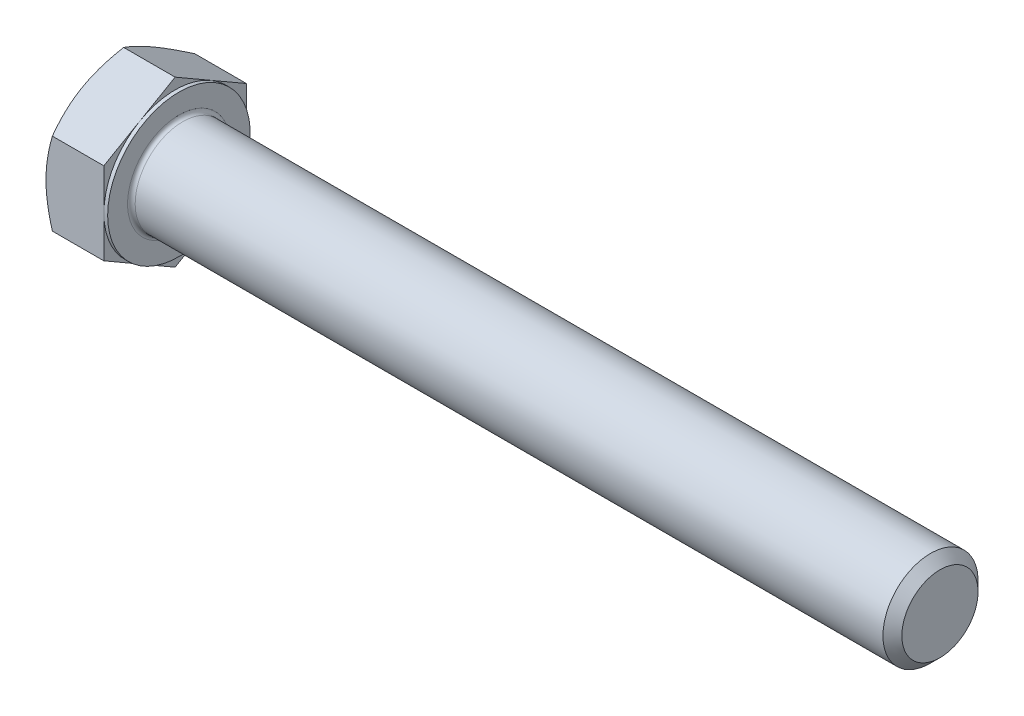
ISO-10303-21;
HEADER;
FILE_DESCRIPTION(('STEP AP214'),'2;1');
FILE_NAME('part.step','',(''),(''),'','','');
FILE_SCHEMA(('AUTOMOTIVE_DESIGN { 1 0 10303 214 1 1 1 1 }'));
ENDSEC;
DATA;
#1=APPLICATION_CONTEXT('core data for automotive mechanical design processes');
#2=APPLICATION_PROTOCOL_DEFINITION('international standard','automotive_design',2000,#1);
#3=PRODUCT_CONTEXT('',#1,'mechanical');
#4=PRODUCT('Part','Part','',(#3));
#5=PRODUCT_RELATED_PRODUCT_CATEGORY('part','',(#4));
#6=PRODUCT_DEFINITION_FORMATION('','',#4);
#7=PRODUCT_DEFINITION_CONTEXT('part definition',#1,'design');
#8=PRODUCT_DEFINITION('design','',#6,#7);
#9=PRODUCT_DEFINITION_SHAPE('','',#8);
#10=(LENGTH_UNIT() NAMED_UNIT(*) SI_UNIT(.MILLI.,.METRE.));
#11=(NAMED_UNIT(*) PLANE_ANGLE_UNIT() SI_UNIT($,.RADIAN.));
#12=(NAMED_UNIT(*) SI_UNIT($,.STERADIAN.) SOLID_ANGLE_UNIT());
#13=UNCERTAINTY_MEASURE_WITH_UNIT(LENGTH_MEASURE(1.E-05),#10,'distance_accuracy_value','');
#14=(GEOMETRIC_REPRESENTATION_CONTEXT(3) GLOBAL_UNCERTAINTY_ASSIGNED_CONTEXT((#13)) GLOBAL_UNIT_ASSIGNED_CONTEXT((#10,
#11,#12)) REPRESENTATION_CONTEXT('',''));
#15=CARTESIAN_POINT('',(0.,0.,0.));
#16=DIRECTION('',(0.,0.,1.));
#17=DIRECTION('',(1.,0.,0.));
#18=AXIS2_PLACEMENT_3D('',#15,#16,#17);
#19=CARTESIAN_POINT('',(0.,8.24155962262808,0.));
#20=DIRECTION('',(1.,0.,0.));
#21=DIRECTION('',(0.,0.,-1.));
#22=AXIS2_PLACEMENT_3D('',#19,#20,#21);
#23=PLANE('',#22);
#24=CARTESIAN_POINT('',(0.,0.,0.));
#25=DIRECTION('',(1.,0.,0.));
#26=DIRECTION('',(0.,0.,-1.));
#27=AXIS2_PLACEMENT_3D('',#24,#25,#26);
#28=CIRCLE('',#27,7.1374);
#29=CARTESIAN_POINT('',(0.,-6.18116971697105,-3.56870000000001));
#30=VERTEX_POINT('',#29);
#31=CARTESIAN_POINT('',(0.,0.,-7.1374));
#32=VERTEX_POINT('',#31);
#33=EDGE_CURVE('E150',#30,#32,#28,.T.);
#34=ORIENTED_EDGE('',*,*,#33,.F.);
#35=CARTESIAN_POINT('',(0.,0.,0.));
#36=DIRECTION('',(1.,0.,0.));
#37=DIRECTION('',(0.,0.,-1.));
#38=AXIS2_PLACEMENT_3D('',#35,#36,#37);
#39=CIRCLE('',#38,7.1374);
#40=CARTESIAN_POINT('',(0.,-6.18116971697106,3.56870000000001));
#41=VERTEX_POINT('',#40);
#42=EDGE_CURVE('E454',#41,#30,#39,.T.);
#43=ORIENTED_EDGE('',*,*,#42,.F.);
#44=CARTESIAN_POINT('',(0.,0.,0.));
#45=DIRECTION('',(1.,0.,0.));
#46=DIRECTION('',(0.,0.,-1.));
#47=AXIS2_PLACEMENT_3D('',#44,#45,#46);
#48=CIRCLE('',#47,7.1374);
#49=CARTESIAN_POINT('',(0.,0.,7.1374));
#50=VERTEX_POINT('',#49);
#51=EDGE_CURVE('E95',#50,#41,#48,.T.);
#52=ORIENTED_EDGE('',*,*,#51,.F.);
#53=CARTESIAN_POINT('',(0.,0.,0.));
#54=DIRECTION('',(1.,0.,0.));
#55=DIRECTION('',(0.,0.,-1.));
#56=AXIS2_PLACEMENT_3D('',#53,#54,#55);
#57=CIRCLE('',#56,7.1374);
#58=CARTESIAN_POINT('',(0.,6.18116971697105,3.56870000000001));
#59=VERTEX_POINT('',#58);
#60=EDGE_CURVE('E92',#59,#50,#57,.T.);
#61=ORIENTED_EDGE('',*,*,#60,.F.);
#62=CARTESIAN_POINT('',(0.,0.,0.));
#63=DIRECTION('',(1.,0.,0.));
#64=DIRECTION('',(0.,0.,-1.));
#65=AXIS2_PLACEMENT_3D('',#62,#63,#64);
#66=CIRCLE('',#65,7.1374);
#67=CARTESIAN_POINT('',(0.,6.18116971697105,-3.56870000000001));
#68=VERTEX_POINT('',#67);
#69=EDGE_CURVE('E19',#68,#59,#66,.T.);
#70=ORIENTED_EDGE('',*,*,#69,.F.);
#71=CARTESIAN_POINT('',(0.,0.,0.));
#72=DIRECTION('',(1.,0.,0.));
#73=DIRECTION('',(0.,0.,-1.));
#74=AXIS2_PLACEMENT_3D('',#71,#72,#73);
#75=CIRCLE('',#74,7.1374);
#76=EDGE_CURVE('E450',#32,#68,#75,.T.);
#77=ORIENTED_EDGE('',*,*,#76,.F.);
#78=EDGE_LOOP('',(#34,#43,#52,#61,#70,#77));
#79=FACE_BOUND('',#78,.T.);
#80=ADVANCED_FACE('F16',(#79),#23,.F.);
#81=CARTESIAN_POINT('',(0.641311776484745,0.,0.));
#82=DIRECTION('',(1.,0.,0.));
#83=DIRECTION('',(0.,0.,-1.));
#84=AXIS2_PLACEMENT_3D('',#81,#82,#83);
#85=CONICAL_SURFACE('',#84,8.24818458036385,1.0471975511966);
#86=CARTESIAN_POINT('',(0.637486855352629,8.24155962262808,0.));
#87=CARTESIAN_POINT('',(0.540632343376936,8.07384476218821,-0.290490659466181));
#88=CARTESIAN_POINT('',(0.45189670079079,7.90478678087674,-0.583307672522675));
#89=CARTESIAN_POINT('',(0.295412992760162,7.56518058886255,-1.17152285165624));
#90=CARTESIAN_POINT('',(0.227561148311182,7.39464422393006,-1.46690050025742));
#91=CARTESIAN_POINT('',(0.144250603082622,7.13723022712835,-1.91275462129736));
#92=CARTESIAN_POINT('',(0.119548178265521,7.05110039256494,-2.06193587080869));
#93=CARTESIAN_POINT('',(0.076787765973701,6.87842838481194,-2.3610125612818));
#94=CARTESIAN_POINT('',(0.0587296036169442,6.79188622253589,-2.5109079833408));
#95=CARTESIAN_POINT('',(0.0295749978503029,6.61806945060962,-2.81196746352471));
#96=CARTESIAN_POINT('',(0.018513957746778,6.53079334497842,-2.96313411276469));
#97=CARTESIAN_POINT('',(0.00371114889843529,6.35606948988297,-3.26576470708432));
#98=CARTESIAN_POINT('',(-2.91702878331806E-05,6.26862170985651,-3.41722870509924));
#99=CARTESIAN_POINT('',(0.,6.18116971697105,-3.56870000000001));
#100=B_SPLINE_CURVE_WITH_KNOTS('',3,(#86,#87,#88,#89,#90,#91,#92,#93,#94,#95,#96,#97,#98,#99),
.UNSPECIFIED.,.F.,.F.,(4,2,2,2,2,2,4),(0.,1.04782264911952,2.09035093998393,2.61229909294058,
3.13423350684215,3.65878806104566,4.18344647054617),.UNSPECIFIED.);
#101=CARTESIAN_POINT('',(0.637486855352629,8.24155962262808,0.));
#102=VERTEX_POINT('',#101);
#103=EDGE_CURVE('E113',#102,#68,#100,.T.);
#104=ORIENTED_EDGE('',*,*,#103,.T.);
#105=ORIENTED_EDGE('',*,*,#69,.T.);
#106=CARTESIAN_POINT('',(0.,6.18116971697105,3.56870000000001));
#107=CARTESIAN_POINT('',(-2.9170287834756E-05,6.26862170985651,3.41722870509925));
#108=CARTESIAN_POINT('',(0.00371114889843365,6.35606948988296,3.26576470708432));
#109=CARTESIAN_POINT('',(0.018513957746776,6.53079334497841,2.9631341127647));
#110=CARTESIAN_POINT('',(0.0295749978503007,6.61806945060961,2.81196746352471));
#111=CARTESIAN_POINT('',(0.0587296036169419,6.79188622253588,2.5109079833408));
#112=CARTESIAN_POINT('',(0.0767877659736988,6.87842838481194,2.3610125612818));
#113=CARTESIAN_POINT('',(0.119548178265519,7.05110039256493,2.06193587080869));
#114=CARTESIAN_POINT('',(0.14425060308262,7.13723022712835,1.91275462129736));
#115=CARTESIAN_POINT('',(0.22756114831118,7.39464422393006,1.46690050025742));
#116=CARTESIAN_POINT('',(0.295412992760161,7.56518058886255,1.17152285165624));
#117=CARTESIAN_POINT('',(0.451896700790789,7.90478678087674,0.583307672522675));
#118=CARTESIAN_POINT('',(0.540632343376935,8.07384476218821,0.29049065946618));
#119=CARTESIAN_POINT('',(0.637486855352629,8.24155962262808,0.));
#120=B_SPLINE_CURVE_WITH_KNOTS('',3,(#106,#107,#108,#109,#110,#111,#112,#113,#114,#115,#116,
#117,#118,#119),.UNSPECIFIED.,.F.,.F.,(4,2,2,2,2,2,4),(0.,0.524658409500518,1.04921296370403,
1.5711473776056,2.09309553056224,3.13562382142665,4.18344647054618),.UNSPECIFIED.);
#121=EDGE_CURVE('E107',#59,#102,#120,.T.);
#122=ORIENTED_EDGE('',*,*,#121,.T.);
#123=EDGE_LOOP('',(#104,#105,#122));
#124=FACE_BOUND('',#123,.T.);
#125=ADVANCED_FACE('F111',(#124),#85,.T.);
#126=CARTESIAN_POINT('',(0.641311776484738,0.,0.));
#127=DIRECTION('',(1.,0.,0.));
#128=DIRECTION('',(0.,0.,-1.));
#129=AXIS2_PLACEMENT_3D('',#126,#127,#128);
#130=CONICAL_SURFACE('',#129,8.24818458036384,1.0471975511966);
#131=CARTESIAN_POINT('',(0.637486855352622,4.12077981131403,7.1374));
#132=CARTESIAN_POINT('',(0.540632343376929,4.2884946717539,6.84690934053382));
#133=CARTESIAN_POINT('',(0.451896700790783,4.45755265306537,6.55409232747733));
#134=CARTESIAN_POINT('',(0.295412992760157,4.79715884507955,5.96587714834377));
#135=CARTESIAN_POINT('',(0.227561148311178,4.96769521001204,5.67049949974259));
#136=CARTESIAN_POINT('',(0.144250603082619,5.22510920681376,5.22464537870266));
#137=CARTESIAN_POINT('',(0.119548178265518,5.31123904137717,5.07546412919132));
#138=CARTESIAN_POINT('',(0.0767877659736985,5.48391104913016,4.77638743871822));
#139=CARTESIAN_POINT('',(0.0587296036169418,5.57045321140622,4.62649201665922));
#140=CARTESIAN_POINT('',(0.0295749978503007,5.74426998333248,4.32543253647531));
#141=CARTESIAN_POINT('',(0.0185139577467759,5.83154608896368,4.17426588723532));
#142=CARTESIAN_POINT('',(0.00371114889843337,6.00626994405913,3.8716352929157));
#143=CARTESIAN_POINT('',(-2.91702878350612E-05,6.09371772408559,3.72017129490078));
#144=CARTESIAN_POINT('',(0.,6.18116971697105,3.56870000000001));
#145=B_SPLINE_CURVE_WITH_KNOTS('',3,(#131,#132,#133,#134,#135,#136,#137,#138,#139,#140,#141,
#142,#143,#144),.UNSPECIFIED.,.F.,.F.,(4,2,2,2,2,2,4),(0.,1.04782264911952,2.09035093998392,
2.61229909294056,3.13423350684213,3.65878806104564,4.18344647054615),.UNSPECIFIED.);
#146=CARTESIAN_POINT('',(0.637486855352622,4.12077981131403,7.1374));
#147=VERTEX_POINT('',#146);
#148=EDGE_CURVE('E100',#147,#59,#145,.T.);
#149=ORIENTED_EDGE('',*,*,#148,.T.);
#150=ORIENTED_EDGE('',*,*,#60,.T.);
#151=CARTESIAN_POINT('',(0.,0.,7.1374));
#152=CARTESIAN_POINT('',(-2.91702878350349E-05,0.174903985770917,7.1374));
#153=CARTESIAN_POINT('',(0.00371114889843339,0.349799545823827,7.1374));
#154=CARTESIAN_POINT('',(0.0185139577467758,0.699247256014725,7.1374));
#155=CARTESIAN_POINT('',(0.0295749978503005,0.873799467277125,7.1374));
#156=CARTESIAN_POINT('',(0.0587296036169414,1.22143301112966,7.1374));
#157=CARTESIAN_POINT('',(0.076787765973698,1.39451733568177,7.1374));
#158=CARTESIAN_POINT('',(0.119548178265517,1.73986135118775,7.1374));
#159=CARTESIAN_POINT('',(0.144250603082619,1.91212102031458,7.1374));
#160=CARTESIAN_POINT('',(0.227561148311177,2.426949013918,7.1374));
#161=CARTESIAN_POINT('',(0.295412992760157,2.76802174378298,7.1374));
#162=CARTESIAN_POINT('',(0.451896700790783,3.44723412781135,7.1374));
#163=CARTESIAN_POINT('',(0.540632343376929,3.78535009043429,7.1374));
#164=CARTESIAN_POINT('',(0.637486855352622,4.12077981131403,7.1374));
#165=B_SPLINE_CURVE_WITH_KNOTS('',3,(#151,#152,#153,#154,#155,#156,#157,#158,#159,#160,#161,
#162,#163,#164),.UNSPECIFIED.,.F.,.F.,(4,2,2,2,2,2,4),(0.,0.524658409500515,1.04921296370402,
1.57114737760559,2.09309553056223,3.13562382142663,4.18344647054615),.UNSPECIFIED.);
#166=EDGE_CURVE('E102',#50,#147,#165,.T.);
#167=ORIENTED_EDGE('',*,*,#166,.T.);
#168=EDGE_LOOP('',(#149,#150,#167));
#169=FACE_BOUND('',#168,.T.);
#170=ADVANCED_FACE('F101',(#169),#130,.T.);
#171=CARTESIAN_POINT('',(0.641311776484745,0.,0.));
#172=DIRECTION('',(1.,0.,0.));
#173=DIRECTION('',(0.,0.,-1.));
#174=AXIS2_PLACEMENT_3D('',#171,#172,#173);
#175=CONICAL_SURFACE('',#174,8.24818458036385,1.0471975511966);
#176=ORIENTED_EDGE('',*,*,#51,.T.);
#177=CARTESIAN_POINT('',(0.,-6.18116971697107,3.56870000000002));
#178=CARTESIAN_POINT('',(-2.9170287825595E-05,-6.09371772408561,3.72017129490078));
#179=CARTESIAN_POINT('',(0.00371114889844298,-6.00626994405915,3.87163529291571));
#180=CARTESIAN_POINT('',(0.0185139577467859,-5.8315460889637,4.17426588723533));
#181=CARTESIAN_POINT('',(0.0295749978503109,-5.7442699833325,4.32543253647531));
#182=CARTESIAN_POINT('',(0.0587296036169516,-5.57045321140624,4.62649201665922));
#183=CARTESIAN_POINT('',(0.0767877659737078,-5.48391104913018,4.77638743871822));
#184=CARTESIAN_POINT('',(0.119548178265527,-5.31123904137719,5.07546412919133));
#185=CARTESIAN_POINT('',(0.144250603082628,-5.22510920681378,5.22464537870266));
#186=CARTESIAN_POINT('',(0.227561148311187,-4.96769521001206,5.6704994997426));
#187=CARTESIAN_POINT('',(0.295412992760166,-4.79715884507958,5.96587714834377));
#188=CARTESIAN_POINT('',(0.451896700790791,-4.45755265306539,6.55409232747733));
#189=CARTESIAN_POINT('',(0.540632343376936,-4.28849467175392,6.84690934053382));
#190=CARTESIAN_POINT('',(0.637486855352629,-4.12077981131405,7.1374));
#191=B_SPLINE_CURVE_WITH_KNOTS('',3,(#177,#178,#179,#180,#181,#182,#183,#184,#185,#186,#187,
#188,#189,#190),.UNSPECIFIED.,.F.,.F.,(4,2,2,2,2,2,4),(0.,0.524658409500513,1.04921296370402,
1.57114737760559,2.09309553056223,3.13562382142663,4.18344647054615),.UNSPECIFIED.);
#192=CARTESIAN_POINT('',(0.637486855352629,-4.12077981131405,7.1374));
#193=VERTEX_POINT('',#192);
#194=EDGE_CURVE('E226',#41,#193,#191,.T.);
#195=ORIENTED_EDGE('',*,*,#194,.T.);
#196=CARTESIAN_POINT('',(0.637486855352629,-4.12077981131405,7.1374));
#197=CARTESIAN_POINT('',(0.540632343376935,-3.78535009043431,7.1374));
#198=CARTESIAN_POINT('',(0.451896700790788,-3.44723412781137,7.1374));
#199=CARTESIAN_POINT('',(0.29541299276016,-2.768021743783,7.1374));
#200=CARTESIAN_POINT('',(0.22756114831118,-2.42694901391802,7.1374));
#201=CARTESIAN_POINT('',(0.14425060308262,-1.91212102031459,7.1374));
#202=CARTESIAN_POINT('',(0.119548178265519,-1.73986135118776,7.1374));
#203=CARTESIAN_POINT('',(0.0767877659736989,-1.39451733568178,7.1374));
#204=CARTESIAN_POINT('',(0.0587296036169421,-1.22143301112967,7.1374));
#205=CARTESIAN_POINT('',(0.0295749978503008,-0.87379946727713,7.1374));
#206=CARTESIAN_POINT('',(0.018513957746776,-0.699247256014728,7.1374));
#207=CARTESIAN_POINT('',(0.00371114889843334,-0.349799545823828,7.1374));
#208=CARTESIAN_POINT('',(-2.91702878350887E-05,-0.174903985770916,7.1374));
#209=CARTESIAN_POINT('',(0.,0.,7.1374));
#210=B_SPLINE_CURVE_WITH_KNOTS('',3,(#196,#197,#198,#199,#200,#201,#202,#203,#204,#205,#206,
#207,#208,#209),.UNSPECIFIED.,.F.,.F.,(4,2,2,2,2,2,4),(0.,1.04782264911953,2.09035093998394,
2.61229909294058,3.13423350684215,3.65878806104566,4.18344647054618),.UNSPECIFIED.);
#211=EDGE_CURVE('E121',#193,#50,#210,.T.);
#212=ORIENTED_EDGE('',*,*,#211,.T.);
#213=EDGE_LOOP('',(#176,#195,#212));
#214=FACE_BOUND('',#213,.T.);
#215=ADVANCED_FACE('F216',(#214),#175,.T.);
#216=CARTESIAN_POINT('',(0.641311776484754,0.,0.));
#217=DIRECTION('',(1.,0.,0.));
#218=DIRECTION('',(0.,0.,-1.));
#219=AXIS2_PLACEMENT_3D('',#216,#217,#218);
#220=CONICAL_SURFACE('',#219,8.24818458036387,1.0471975511966);
#221=ORIENTED_EDGE('',*,*,#42,.T.);
#222=CARTESIAN_POINT('',(0.,-6.18116971697106,-3.56870000000002));
#223=CARTESIAN_POINT('',(-2.91702878281906E-05,-6.26862170985652,-3.41722870509925));
#224=CARTESIAN_POINT('',(0.00371114889844038,-6.35606948988297,-3.26576470708432));
#225=CARTESIAN_POINT('',(0.0185139577467835,-6.53079334497843,-2.9631341127647));
#226=CARTESIAN_POINT('',(0.0295749978503088,-6.61806945060963,-2.81196746352471));
#227=CARTESIAN_POINT('',(0.0587296036169501,-6.7918862225359,-2.5109079833408));
#228=CARTESIAN_POINT('',(0.0767877659737066,-6.87842838481195,-2.3610125612818));
#229=CARTESIAN_POINT('',(0.119548178265526,-7.05110039256495,-2.06193587080869));
#230=CARTESIAN_POINT('',(0.144250603082628,-7.13723022712836,-1.91275462129736));
#231=CARTESIAN_POINT('',(0.227561148311189,-7.39464422393007,-1.46690050025742));
#232=CARTESIAN_POINT('',(0.295412992760169,-7.56518058886256,-1.17152285165624));
#233=CARTESIAN_POINT('',(0.451896700790797,-7.90478678087675,-0.583307672522674));
#234=CARTESIAN_POINT('',(0.540632343376944,-8.07384476218822,-0.290490659466179));
#235=CARTESIAN_POINT('',(0.637486855352638,-8.2415596226281,0.));
#236=B_SPLINE_CURVE_WITH_KNOTS('',3,(#222,#223,#224,#225,#226,#227,#228,#229,#230,#231,#232,
#233,#234,#235),.UNSPECIFIED.,.F.,.F.,(4,2,2,2,2,2,4),(0.,0.524658409500519,1.04921296370403,
1.5711473776056,2.09309553056225,3.13562382142666,4.18344647054619),.UNSPECIFIED.);
#237=CARTESIAN_POINT('',(0.637486855352637,-8.2415596226281,0.));
#238=VERTEX_POINT('',#237);
#239=EDGE_CURVE('E208',#30,#238,#236,.T.);
#240=ORIENTED_EDGE('',*,*,#239,.T.);
#241=CARTESIAN_POINT('',(0.637486855352637,-8.2415596226281,0.));
#242=CARTESIAN_POINT('',(0.540632343376944,-8.07384476218822,0.290490659466181));
#243=CARTESIAN_POINT('',(0.451896700790797,-7.90478678087675,0.583307672522676));
#244=CARTESIAN_POINT('',(0.295412992760169,-7.56518058886257,1.17152285165624));
#245=CARTESIAN_POINT('',(0.227561148311189,-7.39464422393008,1.46690050025742));
#246=CARTESIAN_POINT('',(0.14425060308263,-7.13723022712836,1.91275462129736));
#247=CARTESIAN_POINT('',(0.119548178265528,-7.05110039256495,2.06193587080869));
#248=CARTESIAN_POINT('',(0.0767877659737086,-6.87842838481196,2.3610125612818));
#249=CARTESIAN_POINT('',(0.0587296036169518,-6.7918862225359,2.5109079833408));
#250=CARTESIAN_POINT('',(0.0295749978503104,-6.61806945060963,2.81196746352471));
#251=CARTESIAN_POINT('',(0.0185139577467855,-6.53079334497843,2.9631341127647));
#252=CARTESIAN_POINT('',(0.00371114889844278,-6.35606948988298,3.26576470708432));
#253=CARTESIAN_POINT('',(-2.91702878256121E-05,-6.26862170985652,3.41722870509925));
#254=CARTESIAN_POINT('',(0.,-6.18116971697107,3.56870000000002));
#255=B_SPLINE_CURVE_WITH_KNOTS('',3,(#241,#242,#243,#244,#245,#246,#247,#248,#249,#250,#251,
#252,#253,#254),.UNSPECIFIED.,.F.,.F.,(4,2,2,2,2,2,4),(0.,1.04782264911953,2.09035093998394,
2.61229909294058,3.13423350684215,3.65878806104566,4.18344647054618),.UNSPECIFIED.);
#256=EDGE_CURVE('E221',#238,#41,#255,.T.);
#257=ORIENTED_EDGE('',*,*,#256,.T.);
#258=EDGE_LOOP('',(#221,#240,#257));
#259=FACE_BOUND('',#258,.T.);
#260=ADVANCED_FACE('F213',(#259),#220,.T.);
#261=CARTESIAN_POINT('',(0.641311776484739,0.,0.));
#262=DIRECTION('',(1.,0.,0.));
#263=DIRECTION('',(0.,0.,-1.));
#264=AXIS2_PLACEMENT_3D('',#261,#262,#263);
#265=CONICAL_SURFACE('',#264,8.24818458036384,1.0471975511966);
#266=CARTESIAN_POINT('',(0.637486855352624,4.12077981131404,-7.1374));
#267=CARTESIAN_POINT('',(0.540632343376931,3.78535009043429,-7.1374));
#268=CARTESIAN_POINT('',(0.451896700790785,3.44723412781136,-7.1374));
#269=CARTESIAN_POINT('',(0.295412992760157,2.76802174378299,-7.1374));
#270=CARTESIAN_POINT('',(0.227561148311177,2.42694901391801,-7.1374));
#271=CARTESIAN_POINT('',(0.144250603082619,1.91212102031458,-7.1374));
#272=CARTESIAN_POINT('',(0.119548178265517,1.73986135118776,-7.1374));
#273=CARTESIAN_POINT('',(0.076787765973698,1.39451733568178,-7.1374));
#274=CARTESIAN_POINT('',(0.0587296036169412,1.22143301112966,-7.1374));
#275=CARTESIAN_POINT('',(0.0295749978502998,0.873799467277126,-7.1374));
#276=CARTESIAN_POINT('',(0.018513957746775,0.699247256014726,-7.1374));
#277=CARTESIAN_POINT('',(0.0037111488984325,0.349799545823827,-7.1374));
#278=CARTESIAN_POINT('',(-2.91702878357943E-05,0.174903985770916,-7.1374));
#279=CARTESIAN_POINT('',(0.,0.,-7.1374));
#280=B_SPLINE_CURVE_WITH_KNOTS('',3,(#266,#267,#268,#269,#270,#271,#272,#273,#274,#275,#276,
#277,#278,#279),.UNSPECIFIED.,.F.,.F.,(4,2,2,2,2,2,4),(0.,1.04782264911952,2.09035093998393,
2.61229909294057,3.13423350684214,3.65878806104565,4.18344647054616),.UNSPECIFIED.);
#281=CARTESIAN_POINT('',(0.637486855352624,4.12077981131404,-7.1374));
#282=VERTEX_POINT('',#281);
#283=EDGE_CURVE('E187',#282,#32,#280,.T.);
#284=ORIENTED_EDGE('',*,*,#283,.T.);
#285=ORIENTED_EDGE('',*,*,#76,.T.);
#286=CARTESIAN_POINT('',(0.,6.18116971697105,-3.56870000000001));
#287=CARTESIAN_POINT('',(-2.9170287832926E-05,6.0937177240856,-3.72017129490077));
#288=CARTESIAN_POINT('',(0.00371114889843545,6.00626994405914,-3.8716352929157));
#289=CARTESIAN_POINT('',(0.018513957746778,5.83154608896369,-4.17426588723532));
#290=CARTESIAN_POINT('',(0.0295749978503029,5.74426998333249,-4.32543253647531));
#291=CARTESIAN_POINT('',(0.0587296036169437,5.57045321140622,-4.62649201665922));
#292=CARTESIAN_POINT('',(0.0767877659737001,5.48391104913017,-4.77638743871822));
#293=CARTESIAN_POINT('',(0.119548178265519,5.31123904137718,-5.07546412919132));
#294=CARTESIAN_POINT('',(0.144250603082621,5.22510920681376,-5.22464537870265));
#295=CARTESIAN_POINT('',(0.22756114831118,4.96769521001205,-5.67049949974259));
#296=CARTESIAN_POINT('',(0.295412992760159,4.79715884507956,-5.96587714834377));
#297=CARTESIAN_POINT('',(0.451896700790785,4.45755265306538,-6.55409232747733));
#298=CARTESIAN_POINT('',(0.540632343376931,4.28849467175391,-6.84690934053382));
#299=CARTESIAN_POINT('',(0.637486855352624,4.12077981131404,-7.1374));
#300=B_SPLINE_CURVE_WITH_KNOTS('',3,(#286,#287,#288,#289,#290,#291,#292,#293,#294,#295,#296,
#297,#298,#299),.UNSPECIFIED.,.F.,.F.,(4,2,2,2,2,2,4),(0.,0.524658409500515,1.04921296370402,
1.57114737760559,2.09309553056223,3.13562382142663,4.18344647054615),.UNSPECIFIED.);
#301=EDGE_CURVE('E108',#68,#282,#300,.T.);
#302=ORIENTED_EDGE('',*,*,#301,.T.);
#303=EDGE_LOOP('',(#284,#285,#302));
#304=FACE_BOUND('',#303,.T.);
#305=ADVANCED_FACE('F165',(#304),#265,.T.);
#306=CARTESIAN_POINT('',(0.641311776484743,0.,0.));
#307=DIRECTION('',(1.,0.,0.));
#308=DIRECTION('',(0.,0.,-1.));
#309=AXIS2_PLACEMENT_3D('',#306,#307,#308);
#310=CONICAL_SURFACE('',#309,8.24818458036385,1.0471975511966);
#311=ORIENTED_EDGE('',*,*,#33,.T.);
#312=CARTESIAN_POINT('',(0.,0.,-7.1374));
#313=CARTESIAN_POINT('',(-2.91702878363875E-05,-0.174903985770917,-7.1374));
#314=CARTESIAN_POINT('',(0.0037111488984321,-0.349799545823828,-7.1374));
#315=CARTESIAN_POINT('',(0.0185139577467752,-0.699247256014727,-7.1374));
#316=CARTESIAN_POINT('',(0.0295749978503004,-0.873799467277128,-7.1374));
#317=CARTESIAN_POINT('',(0.0587296036169417,-1.22143301112966,-7.1374));
#318=CARTESIAN_POINT('',(0.0767877659736981,-1.39451733568178,-7.1374));
#319=CARTESIAN_POINT('',(0.119548178265518,-1.73986135118776,-7.1374));
#320=CARTESIAN_POINT('',(0.144250603082619,-1.91212102031459,-7.1374));
#321=CARTESIAN_POINT('',(0.227561148311179,-2.42694901391801,-7.1374));
#322=CARTESIAN_POINT('',(0.295412992760159,-2.76802174378299,-7.1374));
#323=CARTESIAN_POINT('',(0.451896700790786,-3.44723412781136,-7.1374));
#324=CARTESIAN_POINT('',(0.540632343376933,-3.7853500904343,-7.1374));
#325=CARTESIAN_POINT('',(0.637486855352627,-4.12077981131404,-7.1374));
#326=B_SPLINE_CURVE_WITH_KNOTS('',3,(#312,#313,#314,#315,#316,#317,#318,#319,#320,#321,#322,
#323,#324,#325),.UNSPECIFIED.,.F.,.F.,(4,2,2,2,2,2,4),(0.,0.524658409500517,1.04921296370403,
1.5711473776056,2.09309553056224,3.13562382142665,4.18344647054617),.UNSPECIFIED.);
#327=CARTESIAN_POINT('',(0.637486855352626,-4.12077981131404,-7.1374));
#328=VERTEX_POINT('',#327);
#329=EDGE_CURVE('E179',#32,#328,#326,.T.);
#330=ORIENTED_EDGE('',*,*,#329,.T.);
#331=CARTESIAN_POINT('',(0.637486855352626,-4.12077981131404,-7.1374));
#332=CARTESIAN_POINT('',(0.540632343376933,-4.28849467175391,-6.84690934053382));
#333=CARTESIAN_POINT('',(0.451896700790788,-4.45755265306538,-6.55409232747733));
#334=CARTESIAN_POINT('',(0.295412992760162,-4.79715884507957,-5.96587714834377));
#335=CARTESIAN_POINT('',(0.227561148311183,-4.96769521001206,-5.6704994997426));
#336=CARTESIAN_POINT('',(0.144250603082625,-5.22510920681377,-5.22464537870266));
#337=CARTESIAN_POINT('',(0.119548178265524,-5.31123904137718,-5.07546412919133));
#338=CARTESIAN_POINT('',(0.076787765973705,-5.48391104913017,-4.77638743871822));
#339=CARTESIAN_POINT('',(0.0587296036169484,-5.57045321140623,-4.62649201665922));
#340=CARTESIAN_POINT('',(0.0295749978503076,-5.7442699833325,-4.32543253647532));
#341=CARTESIAN_POINT('',(0.0185139577467831,-5.8315460889637,-4.17426588723533));
#342=CARTESIAN_POINT('',(0.00371114889844091,-6.00626994405915,-3.87163529291571));
#343=CARTESIAN_POINT('',(-2.91702878274496E-05,-6.0937177240856,-3.72017129490078));
#344=CARTESIAN_POINT('',(0.,-6.18116971697106,-3.56870000000002));
#345=B_SPLINE_CURVE_WITH_KNOTS('',3,(#331,#332,#333,#334,#335,#336,#337,#338,#339,#340,#341,
#342,#343,#344),.UNSPECIFIED.,.F.,.F.,(4,2,2,2,2,2,4),(0.,1.04782264911952,2.09035093998392,
2.61229909294056,3.13423350684212,3.65878806104563,4.18344647054614),.UNSPECIFIED.);
#346=EDGE_CURVE('E171',#328,#30,#345,.T.);
#347=ORIENTED_EDGE('',*,*,#346,.T.);
#348=EDGE_LOOP('',(#311,#330,#347));
#349=FACE_BOUND('',#348,.T.);
#350=ADVANCED_FACE('F160',(#349),#310,.T.);
#351=CARTESIAN_POINT('',(6.1722,4.12077981131404,-7.1374));
#352=DIRECTION('',(0.,-0.866025403784438,0.500000000000001));
#353=DIRECTION('',(0.,-0.500000000000001,-0.866025403784438));
#354=AXIS2_PLACEMENT_3D('',#351,#352,#353);
#355=PLANE('',#354);
#356=DIRECTION('',(1.,0.,0.));
#357=VECTOR('',#356,1.);
#358=CARTESIAN_POINT('',(6.1722,4.12077981131404,-7.1374));
#359=LINE('',#358,#357);
#360=CARTESIAN_POINT('',(5.7912,4.12077981131404,-7.1374));
#361=VERTEX_POINT('',#360);
#362=EDGE_CURVE('E368',#361,#282,#359,.F.);
#363=ORIENTED_EDGE('',*,*,#362,.T.);
#364=ORIENTED_EDGE('',*,*,#301,.F.);
#365=ORIENTED_EDGE('',*,*,#103,.F.);
#366=DIRECTION('',(1.,0.,0.));
#367=VECTOR('',#366,1.);
#368=CARTESIAN_POINT('',(6.1722,8.24155962262808,0.));
#369=LINE('',#368,#367);
#370=CARTESIAN_POINT('',(5.7912,8.24155962262808,0.));
#371=VERTEX_POINT('',#370);
#372=EDGE_CURVE('E119',#102,#371,#369,.T.);
#373=ORIENTED_EDGE('',*,*,#372,.T.);
#374=DIRECTION('',(0.,0.500000000000002,0.866025403784437));
#375=VECTOR('',#374,1.);
#376=CARTESIAN_POINT('',(5.7912,6.18116971697105,-3.56870000000001));
#377=LINE('',#376,#375);
#378=CARTESIAN_POINT('',(5.7912,6.18116971697105,-3.5687));
#379=VERTEX_POINT('',#378);
#380=EDGE_CURVE('E323',#379,#371,#377,.T.);
#381=ORIENTED_EDGE('',*,*,#380,.F.);
#382=DIRECTION('',(0.,0.5,0.866025403784439));
#383=VECTOR('',#382,1.);
#384=CARTESIAN_POINT('',(5.7912,4.12077981131404,-7.1374));
#385=LINE('',#384,#383);
#386=EDGE_CURVE('E376',#361,#379,#385,.T.);
#387=ORIENTED_EDGE('',*,*,#386,.F.);
#388=EDGE_LOOP('',(#363,#364,#365,#373,#381,#387));
#389=FACE_BOUND('',#388,.T.);
#390=ADVANCED_FACE('F156',(#389),#355,.F.);
#391=CARTESIAN_POINT('',(6.1722,8.24155962262808,0.));
#392=DIRECTION('',(0.,-0.866025403784438,-0.500000000000001));
#393=DIRECTION('',(0.,0.500000000000001,-0.866025403784438));
#394=AXIS2_PLACEMENT_3D('',#391,#392,#393);
#395=PLANE('',#394);
#396=ORIENTED_EDGE('',*,*,#372,.F.);
#397=ORIENTED_EDGE('',*,*,#121,.F.);
#398=ORIENTED_EDGE('',*,*,#148,.F.);
#399=DIRECTION('',(-1.,0.,0.));
#400=VECTOR('',#399,1.);
#401=CARTESIAN_POINT('',(6.1722,4.12077981131403,7.1374));
#402=LINE('',#401,#400);
#403=CARTESIAN_POINT('',(5.7912,4.12077981131403,7.1374));
#404=VERTEX_POINT('',#403);
#405=EDGE_CURVE('E227',#147,#404,#402,.F.);
#406=ORIENTED_EDGE('',*,*,#405,.T.);
#407=DIRECTION('',(0.,-0.500000000000001,0.866025403784438));
#408=VECTOR('',#407,1.);
#409=CARTESIAN_POINT('',(5.7912,6.18116971697105,3.56870000000001));
#410=LINE('',#409,#408);
#411=CARTESIAN_POINT('',(5.7912,6.18116971697104,3.56870000000001));
#412=VERTEX_POINT('',#411);
#413=EDGE_CURVE('E324',#412,#404,#410,.T.);
#414=ORIENTED_EDGE('',*,*,#413,.F.);
#415=DIRECTION('',(0.,-0.500000000000002,0.866025403784438));
#416=VECTOR('',#415,1.);
#417=CARTESIAN_POINT('',(5.7912,8.24155962262808,0.));
#418=LINE('',#417,#416);
#419=EDGE_CURVE('E318',#371,#412,#418,.T.);
#420=ORIENTED_EDGE('',*,*,#419,.F.);
#421=EDGE_LOOP('',(#396,#397,#398,#406,#414,#420));
#422=FACE_BOUND('',#421,.T.);
#423=ADVANCED_FACE('F116',(#422),#395,.F.);
#424=CARTESIAN_POINT('',(6.1722,4.12077981131403,7.1374));
#425=DIRECTION('',(0.,0.,-1.));
#426=DIRECTION('',(-1.,0.,0.));
#427=AXIS2_PLACEMENT_3D('',#424,#425,#426);
#428=PLANE('',#427);
#429=ORIENTED_EDGE('',*,*,#405,.F.);
#430=ORIENTED_EDGE('',*,*,#166,.F.);
#431=ORIENTED_EDGE('',*,*,#211,.F.);
#432=DIRECTION('',(1.,0.,0.));
#433=VECTOR('',#432,1.);
#434=CARTESIAN_POINT('',(6.1722,-4.12077981131405,7.1374));
#435=LINE('',#434,#433);
#436=CARTESIAN_POINT('',(5.7912,-4.12077981131405,7.1374));
#437=VERTEX_POINT('',#436);
#438=EDGE_CURVE('E361',#193,#437,#435,.T.);
#439=ORIENTED_EDGE('',*,*,#438,.T.);
#440=DIRECTION('',(0.,1.,0.));
#441=VECTOR('',#440,1.);
#442=CARTESIAN_POINT('',(5.7912,7.1374,7.1374));
#443=LINE('',#442,#441);
#444=CARTESIAN_POINT('',(5.7912,0.,7.1374));
#445=VERTEX_POINT('',#444);
#446=EDGE_CURVE('E397',#445,#437,#443,.F.);
#447=ORIENTED_EDGE('',*,*,#446,.F.);
#448=DIRECTION('',(0.,1.,0.));
#449=VECTOR('',#448,1.);
#450=CARTESIAN_POINT('',(5.7912,7.1374,7.1374));
#451=LINE('',#450,#449);
#452=EDGE_CURVE('E332',#404,#445,#451,.F.);
#453=ORIENTED_EDGE('',*,*,#452,.F.);
#454=EDGE_LOOP('',(#429,#430,#431,#439,#447,#453));
#455=FACE_BOUND('',#454,.T.);
#456=ADVANCED_FACE('F234',(#455),#428,.F.);
#457=CARTESIAN_POINT('',(6.1722,-8.2415596226281,0.));
#458=DIRECTION('',(0.,0.866025403784438,-0.500000000000001));
#459=DIRECTION('',(0.,0.500000000000001,0.866025403784438));
#460=AXIS2_PLACEMENT_3D('',#457,#458,#459);
#461=PLANE('',#460);
#462=ORIENTED_EDGE('',*,*,#438,.F.);
#463=ORIENTED_EDGE('',*,*,#194,.F.);
#464=ORIENTED_EDGE('',*,*,#256,.F.);
#465=DIRECTION('',(1.,0.,0.));
#466=VECTOR('',#465,1.);
#467=CARTESIAN_POINT('',(6.1722,-8.2415596226281,0.));
#468=LINE('',#467,#466);
#469=CARTESIAN_POINT('',(5.7912,-8.2415596226281,0.));
#470=VERTEX_POINT('',#469);
#471=EDGE_CURVE('E212',#238,#470,#468,.T.);
#472=ORIENTED_EDGE('',*,*,#471,.T.);
#473=DIRECTION('',(0.,-0.500000000000005,-0.866025403784436));
#474=VECTOR('',#473,1.);
#475=CARTESIAN_POINT('',(5.7912,-6.18116971697105,3.5687));
#476=LINE('',#475,#474);
#477=CARTESIAN_POINT('',(5.7912,-6.18116971697105,3.5687));
#478=VERTEX_POINT('',#477);
#479=EDGE_CURVE('E407',#478,#470,#476,.T.);
#480=ORIENTED_EDGE('',*,*,#479,.F.);
#481=DIRECTION('',(0.,-0.499999999999996,-0.866025403784441));
#482=VECTOR('',#481,1.);
#483=CARTESIAN_POINT('',(5.7912,-4.12077981131405,7.1374));
#484=LINE('',#483,#482);
#485=EDGE_CURVE('E402',#437,#478,#484,.T.);
#486=ORIENTED_EDGE('',*,*,#485,.F.);
#487=EDGE_LOOP('',(#462,#463,#464,#472,#480,#486));
#488=FACE_BOUND('',#487,.T.);
#489=ADVANCED_FACE('F205',(#488),#461,.F.);
#490=CARTESIAN_POINT('',(6.1722,-4.12077981131404,-7.1374));
#491=DIRECTION('',(0.,0.866025403784438,0.500000000000001));
#492=DIRECTION('',(0.,-0.500000000000001,0.866025403784438));
#493=AXIS2_PLACEMENT_3D('',#490,#491,#492);
#494=PLANE('',#493);
#495=ORIENTED_EDGE('',*,*,#471,.F.);
#496=ORIENTED_EDGE('',*,*,#239,.F.);
#497=ORIENTED_EDGE('',*,*,#346,.F.);
#498=DIRECTION('',(1.,0.,0.));
#499=VECTOR('',#498,1.);
#500=CARTESIAN_POINT('',(6.1722,-4.12077981131404,-7.1374));
#501=LINE('',#500,#499);
#502=CARTESIAN_POINT('',(5.7912,-4.12077981131404,-7.1374));
#503=VERTEX_POINT('',#502);
#504=EDGE_CURVE('E186',#328,#503,#501,.T.);
#505=ORIENTED_EDGE('',*,*,#504,.T.);
#506=DIRECTION('',(0.,0.499999999999998,-0.866025403784439));
#507=VECTOR('',#506,1.);
#508=CARTESIAN_POINT('',(5.7912,-6.18116971697105,-3.56870000000001));
#509=LINE('',#508,#507);
#510=CARTESIAN_POINT('',(5.7912,-6.18116971697104,-3.56870000000001));
#511=VERTEX_POINT('',#510);
#512=EDGE_CURVE('E34',#511,#503,#509,.T.);
#513=ORIENTED_EDGE('',*,*,#512,.F.);
#514=DIRECTION('',(0.,0.500000000000005,-0.866025403784436));
#515=VECTOR('',#514,1.);
#516=CARTESIAN_POINT('',(5.7912,-8.2415596226281,0.));
#517=LINE('',#516,#515);
#518=EDGE_CURVE('E412',#470,#511,#517,.T.);
#519=ORIENTED_EDGE('',*,*,#518,.F.);
#520=EDGE_LOOP('',(#495,#496,#497,#505,#513,#519));
#521=FACE_BOUND('',#520,.T.);
#522=ADVANCED_FACE('F198',(#521),#494,.F.);
#523=CARTESIAN_POINT('',(6.1722,4.12077981131404,-7.1374));
#524=DIRECTION('',(0.,0.,1.));
#525=DIRECTION('',(0.,-1.,0.));
#526=AXIS2_PLACEMENT_3D('',#523,#524,#525);
#527=PLANE('',#526);
#528=ORIENTED_EDGE('',*,*,#504,.F.);
#529=ORIENTED_EDGE('',*,*,#329,.F.);
#530=ORIENTED_EDGE('',*,*,#283,.F.);
#531=ORIENTED_EDGE('',*,*,#362,.F.);
#532=DIRECTION('',(0.,1.,0.));
#533=VECTOR('',#532,1.);
#534=CARTESIAN_POINT('',(5.7912,7.1374,-7.1374));
#535=LINE('',#534,#533);
#536=CARTESIAN_POINT('',(5.7912,0.,-7.1374));
#537=VERTEX_POINT('',#536);
#538=EDGE_CURVE('E381',#537,#361,#535,.T.);
#539=ORIENTED_EDGE('',*,*,#538,.F.);
#540=DIRECTION('',(0.,1.,0.));
#541=VECTOR('',#540,1.);
#542=CARTESIAN_POINT('',(5.7912,7.1374,-7.1374));
#543=LINE('',#542,#541);
#544=EDGE_CURVE('E341',#503,#537,#543,.T.);
#545=ORIENTED_EDGE('',*,*,#544,.F.);
#546=EDGE_LOOP('',(#528,#529,#530,#531,#539,#545));
#547=FACE_BOUND('',#546,.T.);
#548=ADVANCED_FACE('F193',(#547),#527,.F.);
#549=CARTESIAN_POINT('',(5.7912,7.1374,0.));
#550=DIRECTION('',(1.,0.,0.));
#551=DIRECTION('',(0.,0.,-1.));
#552=AXIS2_PLACEMENT_3D('',#549,#550,#551);
#553=PLANE('',#552);
#554=CARTESIAN_POINT('',(5.7912,0.,0.));
#555=DIRECTION('',(-1.,0.,0.));
#556=DIRECTION('',(0.,0.,1.));
#557=AXIS2_PLACEMENT_3D('',#554,#555,#556);
#558=CIRCLE('',#557,7.1374);
#559=EDGE_CURVE('E188',#537,#379,#558,.F.);
#560=ORIENTED_EDGE('',*,*,#559,.F.);
#561=ORIENTED_EDGE('',*,*,#538,.T.);
#562=ORIENTED_EDGE('',*,*,#386,.T.);
#563=EDGE_LOOP('',(#560,#561,#562));
#564=FACE_BOUND('',#563,.T.);
#565=ADVANCED_FACE('F197',(#564),#553,.T.);
#566=CARTESIAN_POINT('',(5.7912,7.1374,0.));
#567=DIRECTION('',(1.,0.,0.));
#568=DIRECTION('',(0.,0.,-1.));
#569=AXIS2_PLACEMENT_3D('',#566,#567,#568);
#570=PLANE('',#569);
#571=ORIENTED_EDGE('',*,*,#419,.T.);
#572=CARTESIAN_POINT('',(5.7912,0.,0.));
#573=DIRECTION('',(-1.,0.,0.));
#574=DIRECTION('',(0.,0.,1.));
#575=AXIS2_PLACEMENT_3D('',#572,#573,#574);
#576=CIRCLE('',#575,7.1374);
#577=EDGE_CURVE('E321',#379,#412,#576,.F.);
#578=ORIENTED_EDGE('',*,*,#577,.F.);
#579=ORIENTED_EDGE('',*,*,#380,.T.);
#580=EDGE_LOOP('',(#571,#578,#579));
#581=FACE_BOUND('',#580,.T.);
#582=ADVANCED_FACE('F307',(#581),#570,.T.);
#583=CARTESIAN_POINT('',(5.7912,7.1374,0.));
#584=DIRECTION('',(1.,0.,0.));
#585=DIRECTION('',(0.,0.,-1.));
#586=AXIS2_PLACEMENT_3D('',#583,#584,#585);
#587=PLANE('',#586);
#588=ORIENTED_EDGE('',*,*,#452,.T.);
#589=CARTESIAN_POINT('',(5.7912,0.,0.));
#590=DIRECTION('',(-1.,0.,0.));
#591=DIRECTION('',(0.,0.,1.));
#592=AXIS2_PLACEMENT_3D('',#589,#590,#591);
#593=CIRCLE('',#592,7.1374);
#594=EDGE_CURVE('E329',#412,#445,#593,.F.);
#595=ORIENTED_EDGE('',*,*,#594,.F.);
#596=ORIENTED_EDGE('',*,*,#413,.T.);
#597=EDGE_LOOP('',(#588,#595,#596));
#598=FACE_BOUND('',#597,.T.);
#599=ADVANCED_FACE('F304',(#598),#587,.T.);
#600=CARTESIAN_POINT('',(5.7912,7.1374,0.));
#601=DIRECTION('',(1.,0.,0.));
#602=DIRECTION('',(0.,0.,-1.));
#603=AXIS2_PLACEMENT_3D('',#600,#601,#602);
#604=PLANE('',#603);
#605=ORIENTED_EDGE('',*,*,#485,.T.);
#606=CARTESIAN_POINT('',(5.7912,0.,0.));
#607=DIRECTION('',(-1.,0.,0.));
#608=DIRECTION('',(0.,0.,1.));
#609=AXIS2_PLACEMENT_3D('',#606,#607,#608);
#610=CIRCLE('',#609,7.1374);
#611=EDGE_CURVE('E336',#445,#478,#610,.F.);
#612=ORIENTED_EDGE('',*,*,#611,.F.);
#613=ORIENTED_EDGE('',*,*,#446,.T.);
#614=EDGE_LOOP('',(#605,#612,#613));
#615=FACE_BOUND('',#614,.T.);
#616=ADVANCED_FACE('F300',(#615),#604,.T.);
#617=CARTESIAN_POINT('',(5.7912,7.1374,0.));
#618=DIRECTION('',(1.,0.,0.));
#619=DIRECTION('',(0.,0.,-1.));
#620=AXIS2_PLACEMENT_3D('',#617,#618,#619);
#621=PLANE('',#620);
#622=ORIENTED_EDGE('',*,*,#518,.T.);
#623=CARTESIAN_POINT('',(5.7912,0.,0.));
#624=DIRECTION('',(-1.,0.,0.));
#625=DIRECTION('',(0.,0.,1.));
#626=AXIS2_PLACEMENT_3D('',#623,#624,#625);
#627=CIRCLE('',#626,7.1374);
#628=EDGE_CURVE('E344',#478,#511,#627,.F.);
#629=ORIENTED_EDGE('',*,*,#628,.F.);
#630=ORIENTED_EDGE('',*,*,#479,.T.);
#631=EDGE_LOOP('',(#622,#629,#630));
#632=FACE_BOUND('',#631,.T.);
#633=ADVANCED_FACE('F296',(#632),#621,.T.);
#634=CARTESIAN_POINT('',(5.7912,7.1374,0.));
#635=DIRECTION('',(1.,0.,0.));
#636=DIRECTION('',(0.,0.,-1.));
#637=AXIS2_PLACEMENT_3D('',#634,#635,#636);
#638=PLANE('',#637);
#639=ORIENTED_EDGE('',*,*,#544,.T.);
#640=CARTESIAN_POINT('',(5.7912,0.,0.));
#641=DIRECTION('',(-1.,0.,0.));
#642=DIRECTION('',(0.,0.,1.));
#643=AXIS2_PLACEMENT_3D('',#640,#641,#642);
#644=CIRCLE('',#643,7.1374);
#645=EDGE_CURVE('E346',#511,#537,#644,.F.);
#646=ORIENTED_EDGE('',*,*,#645,.F.);
#647=ORIENTED_EDGE('',*,*,#512,.T.);
#648=EDGE_LOOP('',(#639,#646,#647));
#649=FACE_BOUND('',#648,.T.);
#650=ADVANCED_FACE('F292',(#649),#638,.T.);
#651=CARTESIAN_POINT('',(0.,0.,0.));
#652=DIRECTION('',(-1.,0.,0.));
#653=DIRECTION('',(0.,0.,1.));
#654=AXIS2_PLACEMENT_3D('',#651,#652,#653);
#655=CYLINDRICAL_SURFACE('',#654,7.1374);
#656=CARTESIAN_POINT('',(6.1722,0.,0.));
#657=DIRECTION('',(-1.,0.,0.));
#658=DIRECTION('',(0.,0.,1.));
#659=AXIS2_PLACEMENT_3D('',#656,#657,#658);
#660=CIRCLE('',#659,7.1374);
#661=CARTESIAN_POINT('',(6.1722,0.,7.1374));
#662=VERTEX_POINT('',#661);
#663=EDGE_CURVE('E348',#662,#662,#660,.F.);
#664=ORIENTED_EDGE('',*,*,#663,.F.);
#665=EDGE_LOOP('',(#664));
#666=FACE_BOUND('',#665,.T.);
#667=ORIENTED_EDGE('',*,*,#628,.T.);
#668=ORIENTED_EDGE('',*,*,#645,.T.);
#669=ORIENTED_EDGE('',*,*,#559,.T.);
#670=ORIENTED_EDGE('',*,*,#577,.T.);
#671=ORIENTED_EDGE('',*,*,#594,.T.);
#672=ORIENTED_EDGE('',*,*,#611,.T.);
#673=EDGE_LOOP('',(#667,#668,#669,#670,#671,#672));
#674=FACE_BOUND('',#673,.T.);
#675=ADVANCED_FACE('F288',(#666,#674),#655,.T.);
#676=CARTESIAN_POINT('',(6.1722,8.24155962262808,0.));
#677=DIRECTION('',(1.,0.,0.));
#678=DIRECTION('',(0.,0.,-1.));
#679=AXIS2_PLACEMENT_3D('',#676,#677,#678);
#680=PLANE('',#679);
#681=ORIENTED_EDGE('',*,*,#663,.T.);
#682=EDGE_LOOP('',(#681));
#683=FACE_BOUND('',#682,.T.);
#684=CARTESIAN_POINT('',(6.1722,0.,0.));
#685=DIRECTION('',(1.,0.,0.));
#686=DIRECTION('',(0.,0.,-1.));
#687=AXIS2_PLACEMENT_3D('',#684,#685,#686);
#688=CIRCLE('',#687,5.1435);
#689=CARTESIAN_POINT('',(6.1722,0.,-5.1435));
#690=VERTEX_POINT('',#689);
#691=EDGE_CURVE('E275',#690,#690,#688,.F.);
#692=ORIENTED_EDGE('',*,*,#691,.T.);
#693=EDGE_LOOP('',(#692));
#694=FACE_BOUND('',#693,.T.);
#695=ADVANCED_FACE('F279',(#683,#694),#680,.T.);
#696=CARTESIAN_POINT('',(82.3722,0.,0.));
#697=DIRECTION('',(-1.,0.,0.));
#698=DIRECTION('',(0.,0.,1.));
#699=AXIS2_PLACEMENT_3D('',#696,#697,#698);
#700=PLANE('',#699);
#701=CARTESIAN_POINT('',(82.3722000000089,0.,0.));
#702=DIRECTION('',(-1.,0.,0.));
#703=DIRECTION('',(0.,0.,1.));
#704=AXIS2_PLACEMENT_3D('',#701,#702,#703);
#705=CIRCLE('',#704,3.81635000002234);
#706=CARTESIAN_POINT('',(82.3722000000089,0.,3.81635000002234));
#707=VERTEX_POINT('',#706);
#708=EDGE_CURVE('E351',#707,#707,#705,.T.);
#709=ORIENTED_EDGE('',*,*,#708,.F.);
#710=EDGE_LOOP('',(#709));
#711=FACE_BOUND('',#710,.T.);
#712=ADVANCED_FACE('F262',(#711),#700,.F.);
#713=CARTESIAN_POINT('',(6.5532,0.,0.));
#714=DIRECTION('',(1.,0.,0.));
#715=DIRECTION('',(0.,0.,-1.));
#716=AXIS2_PLACEMENT_3D('',#713,#714,#715);
#717=TOROIDAL_SURFACE('',#716,5.1435,0.381);
#718=ORIENTED_EDGE('',*,*,#691,.F.);
#719=EDGE_LOOP('',(#718));
#720=FACE_BOUND('',#719,.T.);
#721=CARTESIAN_POINT('',(6.5532,0.,0.));
#722=DIRECTION('',(-1.,0.,0.));
#723=DIRECTION('',(0.,0.,1.));
#724=AXIS2_PLACEMENT_3D('',#721,#722,#723);
#725=CIRCLE('',#724,4.7625);
#726=CARTESIAN_POINT('',(6.5532,0.,4.7625));
#727=VERTEX_POINT('',#726);
#728=EDGE_CURVE('E25',#727,#727,#725,.F.);
#729=ORIENTED_EDGE('',*,*,#728,.F.);
#730=EDGE_LOOP('',(#729));
#731=FACE_BOUND('',#730,.T.);
#732=ADVANCED_FACE('F253',(#720,#731),#717,.F.);
#733=CARTESIAN_POINT('',(81.4260500000046,0.,0.));
#734=DIRECTION('',(-1.,0.,0.));
#735=DIRECTION('',(0.,0.,1.));
#736=AXIS2_PLACEMENT_3D('',#733,#734,#735);
#737=CONICAL_SURFACE('',#736,4.7624999999698,0.785398163367409);
#738=ORIENTED_EDGE('',*,*,#708,.T.);
#739=EDGE_LOOP('',(#738));
#740=FACE_BOUND('',#739,.T.);
#741=CARTESIAN_POINT('',(81.42605,0.,0.));
#742=DIRECTION('',(-1.,0.,0.));
#743=DIRECTION('',(0.,0.,1.));
#744=AXIS2_PLACEMENT_3D('',#741,#742,#743);
#745=CIRCLE('',#744,4.7625);
#746=CARTESIAN_POINT('',(81.42605,0.,4.7625));
#747=VERTEX_POINT('',#746);
#748=EDGE_CURVE('E11',#747,#747,#745,.T.);
#749=ORIENTED_EDGE('',*,*,#748,.F.);
#750=EDGE_LOOP('',(#749));
#751=FACE_BOUND('',#750,.T.);
#752=ADVANCED_FACE('F247',(#740,#751),#737,.T.);
#753=CARTESIAN_POINT('',(0.,0.,0.));
#754=DIRECTION('',(-1.,0.,0.));
#755=DIRECTION('',(0.,0.,1.));
#756=AXIS2_PLACEMENT_3D('',#753,#754,#755);
#757=CYLINDRICAL_SURFACE('',#756,4.7625);
#758=ORIENTED_EDGE('',*,*,#748,.T.);
#759=EDGE_LOOP('',(#758));
#760=FACE_BOUND('',#759,.T.);
#761=ORIENTED_EDGE('',*,*,#728,.T.);
#762=EDGE_LOOP('',(#761));
#763=FACE_BOUND('',#762,.T.);
#764=ADVANCED_FACE('F245',(#760,#763),#757,.T.);
#765=CLOSED_SHELL('',(#80,#125,#170,#215,#260,#305,#350,#390,#423,#456,#489,#522,#548,#565,#582,
#599,#616,#633,#650,#675,#695,#712,#732,#752,#764));
#766=MANIFOLD_SOLID_BREP('B1',#765);
#767=ADVANCED_BREP_SHAPE_REPRESENTATION('',(#18,#766),#14);
#768=SHAPE_DEFINITION_REPRESENTATION(#9,#767);
ENDSEC;
END-ISO-10303-21;
